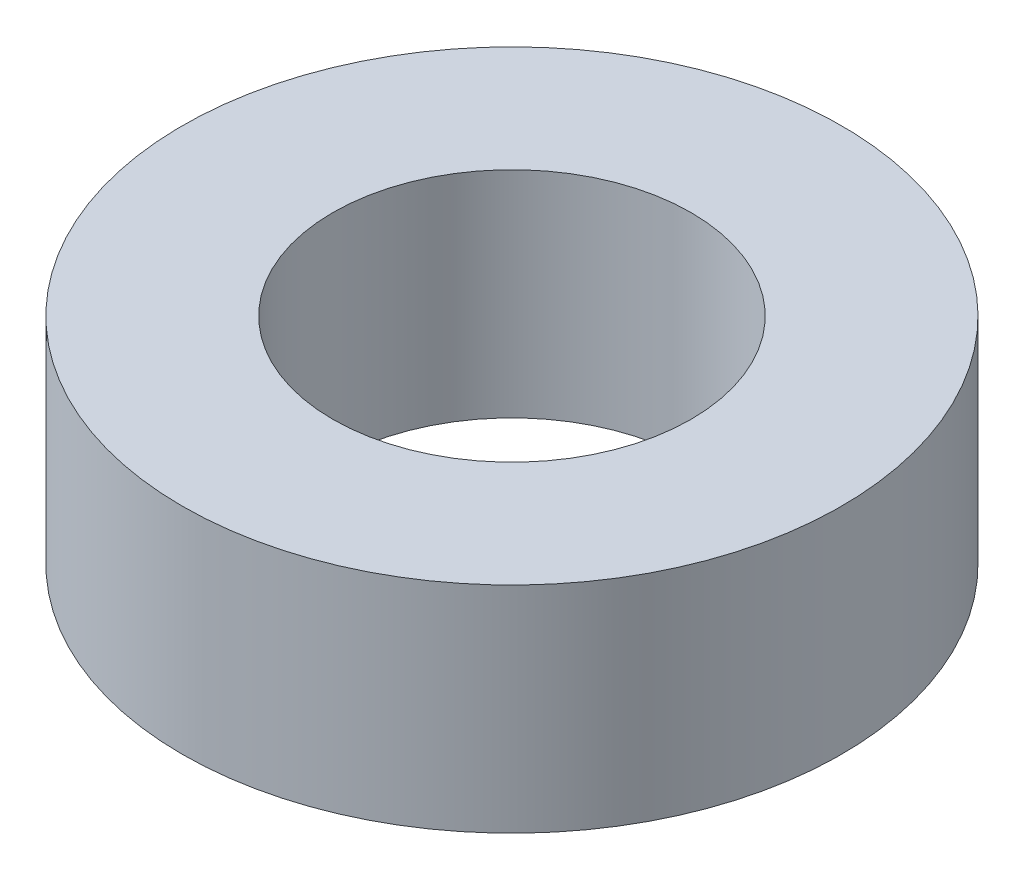
ISO-10303-21;
HEADER;
FILE_DESCRIPTION(('STEP AP214'),'2;1');
FILE_NAME('part.step','',(''),(''),'','','');
FILE_SCHEMA(('AUTOMOTIVE_DESIGN { 1 0 10303 214 1 1 1 1 }'));
ENDSEC;
DATA;
#1=APPLICATION_CONTEXT('core data for automotive mechanical design processes');
#2=APPLICATION_PROTOCOL_DEFINITION('international standard','automotive_design',2000,#1);
#3=PRODUCT_CONTEXT('',#1,'mechanical');
#4=PRODUCT('Part','Part','',(#3));
#5=PRODUCT_RELATED_PRODUCT_CATEGORY('part','',(#4));
#6=PRODUCT_DEFINITION_FORMATION('','',#4);
#7=PRODUCT_DEFINITION_CONTEXT('part definition',#1,'design');
#8=PRODUCT_DEFINITION('design','',#6,#7);
#9=PRODUCT_DEFINITION_SHAPE('','',#8);
#10=(LENGTH_UNIT() NAMED_UNIT(*) SI_UNIT(.MILLI.,.METRE.));
#11=(NAMED_UNIT(*) PLANE_ANGLE_UNIT() SI_UNIT($,.RADIAN.));
#12=(NAMED_UNIT(*) SI_UNIT($,.STERADIAN.) SOLID_ANGLE_UNIT());
#13=UNCERTAINTY_MEASURE_WITH_UNIT(LENGTH_MEASURE(1.E-05),#10,'distance_accuracy_value','');
#14=(GEOMETRIC_REPRESENTATION_CONTEXT(3) GLOBAL_UNCERTAINTY_ASSIGNED_CONTEXT((#13)) GLOBAL_UNIT_ASSIGNED_CONTEXT((#10,
#11,#12)) REPRESENTATION_CONTEXT('',''));
#15=CARTESIAN_POINT('',(0.,0.,0.));
#16=DIRECTION('',(0.,0.,1.));
#17=DIRECTION('',(1.,0.,0.));
#18=AXIS2_PLACEMENT_3D('',#15,#16,#17);
#19=CARTESIAN_POINT('',(0.,150.,0.));
#20=DIRECTION('',(0.,1.,0.));
#21=DIRECTION('',(0.,0.,1.));
#22=AXIS2_PLACEMENT_3D('',#19,#20,#21);
#23=PLANE('',#22);
#24=CARTESIAN_POINT('',(0.,150.,0.));
#25=DIRECTION('',(0.,1.,0.));
#26=DIRECTION('',(0.,0.,1.));
#27=AXIS2_PLACEMENT_3D('',#24,#25,#26);
#28=CIRCLE('',#27,230.);
#29=CARTESIAN_POINT('',(0.,150.,230.));
#30=VERTEX_POINT('',#29);
#31=EDGE_CURVE('E10',#30,#30,#28,.T.);
#32=ORIENTED_EDGE('',*,*,#31,.T.);
#33=EDGE_LOOP('',(#32));
#34=FACE_BOUND('',#33,.T.);
#35=CARTESIAN_POINT('',(0.,150.,0.));
#36=DIRECTION('',(0.,1.,0.));
#37=DIRECTION('',(0.,0.,1.));
#38=AXIS2_PLACEMENT_3D('',#35,#36,#37);
#39=CIRCLE('',#38,125.);
#40=CARTESIAN_POINT('',(0.,150.,125.));
#41=VERTEX_POINT('',#40);
#42=EDGE_CURVE('E50',#41,#41,#39,.T.);
#43=ORIENTED_EDGE('',*,*,#42,.F.);
#44=EDGE_LOOP('',(#43));
#45=FACE_BOUND('',#44,.T.);
#46=ADVANCED_FACE('F36',(#34,#45),#23,.T.);
#47=CARTESIAN_POINT('',(0.,0.,0.));
#48=DIRECTION('',(0.,1.,0.));
#49=DIRECTION('',(0.,0.,1.));
#50=AXIS2_PLACEMENT_3D('',#47,#48,#49);
#51=PLANE('',#50);
#52=CARTESIAN_POINT('',(0.,0.,0.));
#53=DIRECTION('',(0.,1.,0.));
#54=DIRECTION('',(0.,0.,1.));
#55=AXIS2_PLACEMENT_3D('',#52,#53,#54);
#56=CIRCLE('',#55,230.);
#57=CARTESIAN_POINT('',(0.,0.,230.));
#58=VERTEX_POINT('',#57);
#59=EDGE_CURVE('E40',#58,#58,#56,.T.);
#60=ORIENTED_EDGE('',*,*,#59,.F.);
#61=EDGE_LOOP('',(#60));
#62=FACE_BOUND('',#61,.T.);
#63=CARTESIAN_POINT('',(0.,0.,0.));
#64=DIRECTION('',(0.,1.,0.));
#65=DIRECTION('',(0.,0.,1.));
#66=AXIS2_PLACEMENT_3D('',#63,#64,#65);
#67=CIRCLE('',#66,125.);
#68=CARTESIAN_POINT('',(0.,0.,125.));
#69=VERTEX_POINT('',#68);
#70=EDGE_CURVE('E52',#69,#69,#67,.T.);
#71=ORIENTED_EDGE('',*,*,#70,.T.);
#72=EDGE_LOOP('',(#71));
#73=FACE_BOUND('',#72,.T.);
#74=ADVANCED_FACE('F63',(#62,#73),#51,.F.);
#75=CARTESIAN_POINT('',(0.,150.,0.));
#76=DIRECTION('',(0.,-1.,0.));
#77=DIRECTION('',(0.,0.,-1.));
#78=AXIS2_PLACEMENT_3D('',#75,#76,#77);
#79=CYLINDRICAL_SURFACE('',#78,230.);
#80=ORIENTED_EDGE('',*,*,#31,.F.);
#81=EDGE_LOOP('',(#80));
#82=FACE_BOUND('',#81,.T.);
#83=ORIENTED_EDGE('',*,*,#59,.T.);
#84=EDGE_LOOP('',(#83));
#85=FACE_BOUND('',#84,.T.);
#86=ADVANCED_FACE('F38',(#82,#85),#79,.T.);
#87=CARTESIAN_POINT('',(0.,150.,0.));
#88=DIRECTION('',(0.,-1.,0.));
#89=DIRECTION('',(0.,0.,-1.));
#90=AXIS2_PLACEMENT_3D('',#87,#88,#89);
#91=CYLINDRICAL_SURFACE('',#90,125.);
#92=ORIENTED_EDGE('',*,*,#42,.T.);
#93=EDGE_LOOP('',(#92));
#94=FACE_BOUND('',#93,.T.);
#95=ORIENTED_EDGE('',*,*,#70,.F.);
#96=EDGE_LOOP('',(#95));
#97=FACE_BOUND('',#96,.T.);
#98=ADVANCED_FACE('F59',(#94,#97),#91,.F.);
#99=CLOSED_SHELL('',(#46,#74,#86,#98));
#100=MANIFOLD_SOLID_BREP('B2',#99);
#101=ADVANCED_BREP_SHAPE_REPRESENTATION('',(#18,#100),#14);
#102=SHAPE_DEFINITION_REPRESENTATION(#9,#101);
ENDSEC;
END-ISO-10303-21;
